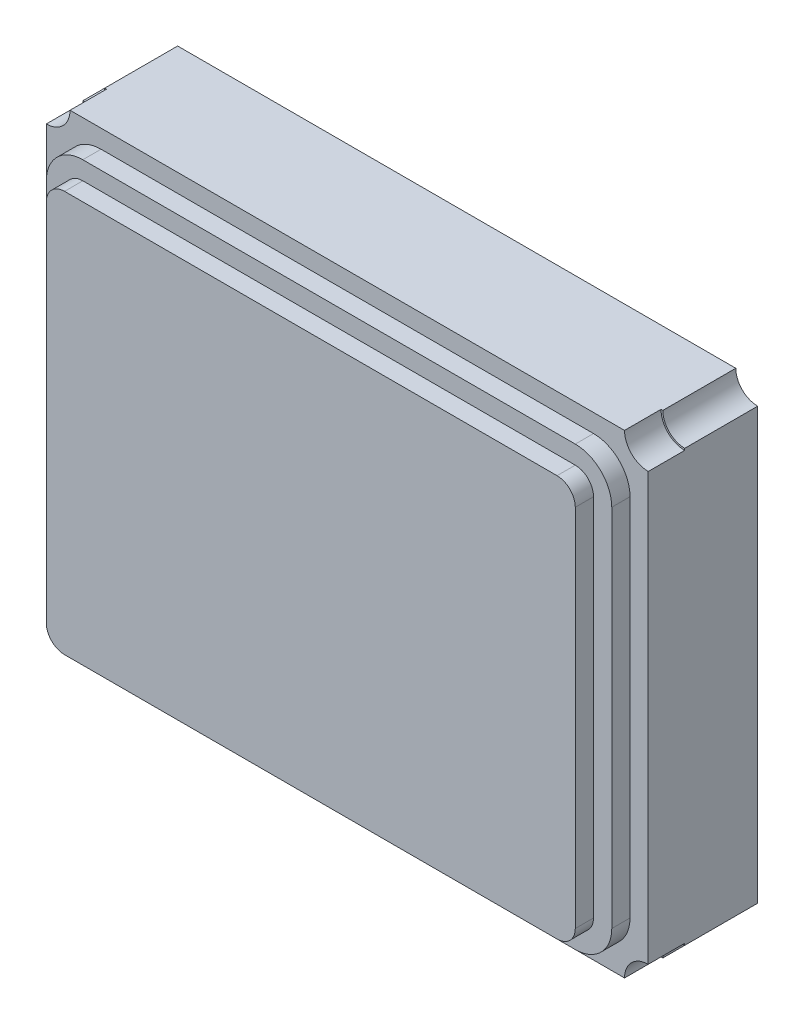
ISO-10303-21;
HEADER;
FILE_DESCRIPTION(('STEP AP214'),'2;1');
FILE_NAME('part.step','',(''),(''),'','','');
FILE_SCHEMA(('AUTOMOTIVE_DESIGN { 1 0 10303 214 1 1 1 1 }'));
ENDSEC;
DATA;
#1=APPLICATION_CONTEXT('core data for automotive mechanical design processes');
#2=APPLICATION_PROTOCOL_DEFINITION('international standard','automotive_design',2000,#1);
#3=PRODUCT_CONTEXT('',#1,'mechanical');
#4=PRODUCT('Part','Part','',(#3));
#5=PRODUCT_RELATED_PRODUCT_CATEGORY('part','',(#4));
#6=PRODUCT_DEFINITION_FORMATION('','',#4);
#7=PRODUCT_DEFINITION_CONTEXT('part definition',#1,'design');
#8=PRODUCT_DEFINITION('design','',#6,#7);
#9=PRODUCT_DEFINITION_SHAPE('','',#8);
#10=(LENGTH_UNIT() NAMED_UNIT(*) SI_UNIT(.MILLI.,.METRE.));
#11=(NAMED_UNIT(*) PLANE_ANGLE_UNIT() SI_UNIT($,.RADIAN.));
#12=(NAMED_UNIT(*) SI_UNIT($,.STERADIAN.) SOLID_ANGLE_UNIT());
#13=UNCERTAINTY_MEASURE_WITH_UNIT(LENGTH_MEASURE(1.E-05),#10,'distance_accuracy_value','');
#14=(GEOMETRIC_REPRESENTATION_CONTEXT(3) GLOBAL_UNCERTAINTY_ASSIGNED_CONTEXT((#13)) GLOBAL_UNIT_ASSIGNED_CONTEXT((#10,
#11,#12)) REPRESENTATION_CONTEXT('',''));
#15=CARTESIAN_POINT('',(0.,0.,0.));
#16=DIRECTION('',(0.,0.,1.));
#17=DIRECTION('',(1.,0.,0.));
#18=AXIS2_PLACEMENT_3D('',#15,#16,#17);
#19=CARTESIAN_POINT('',(1.65,-1.3,0.8));
#20=DIRECTION('',(0.,0.,-1.));
#21=DIRECTION('',(-1.,0.,0.));
#22=AXIS2_PLACEMENT_3D('',#19,#20,#21);
#23=CYLINDRICAL_SURFACE('',#22,0.12);
#24=DIRECTION('',(0.,0.,-1.));
#25=VECTOR('',#24,1.);
#26=CARTESIAN_POINT('',(1.65,-1.18,0.8));
#27=LINE('',#26,#25);
#28=CARTESIAN_POINT('',(1.65,-1.18,0.4));
#29=VERTEX_POINT('',#28);
#30=CARTESIAN_POINT('',(1.65,-1.18,0.));
#31=VERTEX_POINT('',#30);
#32=EDGE_CURVE('E469',#29,#31,#27,.T.);
#33=ORIENTED_EDGE('',*,*,#32,.F.);
#34=CARTESIAN_POINT('',(1.65,-1.3,0.4));
#35=DIRECTION('',(0.,0.,1.));
#36=DIRECTION('',(1.,0.,0.));
#37=AXIS2_PLACEMENT_3D('',#34,#35,#36);
#38=CIRCLE('',#37,0.12);
#39=CARTESIAN_POINT('',(1.53,-1.3,0.4));
#40=VERTEX_POINT('',#39);
#41=EDGE_CURVE('E247',#29,#40,#38,.T.);
#42=ORIENTED_EDGE('',*,*,#41,.T.);
#43=DIRECTION('',(0.,0.,-1.));
#44=VECTOR('',#43,1.);
#45=CARTESIAN_POINT('',(1.53,-1.3,0.8));
#46=LINE('',#45,#44);
#47=CARTESIAN_POINT('',(1.53,-1.3,0.));
#48=VERTEX_POINT('',#47);
#49=EDGE_CURVE('E471',#40,#48,#46,.T.);
#50=ORIENTED_EDGE('',*,*,#49,.T.);
#51=CARTESIAN_POINT('',(1.65,-1.3,0.));
#52=DIRECTION('',(0.,0.,1.));
#53=DIRECTION('',(1.,0.,0.));
#54=AXIS2_PLACEMENT_3D('',#51,#52,#53);
#55=CIRCLE('',#54,0.12);
#56=EDGE_CURVE('E446',#31,#48,#55,.T.);
#57=ORIENTED_EDGE('',*,*,#56,.F.);
#58=EDGE_LOOP('',(#33,#42,#50,#57));
#59=FACE_BOUND('',#58,.T.);
#60=ADVANCED_FACE('F38',(#59),#23,.F.);
#61=CARTESIAN_POINT('',(-1.65,1.3,0.8));
#62=DIRECTION('',(0.,0.,-1.));
#63=DIRECTION('',(-1.,0.,0.));
#64=AXIS2_PLACEMENT_3D('',#61,#62,#63);
#65=CYLINDRICAL_SURFACE('',#64,0.12);
#66=DIRECTION('',(0.,0.,-1.));
#67=VECTOR('',#66,1.);
#68=CARTESIAN_POINT('',(-1.65,1.18,0.8));
#69=LINE('',#68,#67);
#70=CARTESIAN_POINT('',(-1.65,1.18,0.4));
#71=VERTEX_POINT('',#70);
#72=CARTESIAN_POINT('',(-1.65,1.18,0.));
#73=VERTEX_POINT('',#72);
#74=EDGE_CURVE('E461',#71,#73,#69,.T.);
#75=ORIENTED_EDGE('',*,*,#74,.F.);
#76=CARTESIAN_POINT('',(-1.65,1.3,0.4));
#77=DIRECTION('',(0.,0.,1.));
#78=DIRECTION('',(1.,0.,0.));
#79=AXIS2_PLACEMENT_3D('',#76,#77,#78);
#80=CIRCLE('',#79,0.12);
#81=CARTESIAN_POINT('',(-1.53,1.3,0.4));
#82=VERTEX_POINT('',#81);
#83=EDGE_CURVE('E61',#71,#82,#80,.T.);
#84=ORIENTED_EDGE('',*,*,#83,.T.);
#85=DIRECTION('',(0.,0.,-1.));
#86=VECTOR('',#85,1.);
#87=CARTESIAN_POINT('',(-1.53,1.3,0.8));
#88=LINE('',#87,#86);
#89=CARTESIAN_POINT('',(-1.53,1.3,0.));
#90=VERTEX_POINT('',#89);
#91=EDGE_CURVE('E463',#82,#90,#88,.T.);
#92=ORIENTED_EDGE('',*,*,#91,.T.);
#93=CARTESIAN_POINT('',(-1.65,1.3,0.));
#94=DIRECTION('',(0.,0.,1.));
#95=DIRECTION('',(1.,0.,0.));
#96=AXIS2_PLACEMENT_3D('',#93,#94,#95);
#97=CIRCLE('',#96,0.12);
#98=EDGE_CURVE('E458',#73,#90,#97,.T.);
#99=ORIENTED_EDGE('',*,*,#98,.F.);
#100=EDGE_LOOP('',(#75,#84,#92,#99));
#101=FACE_BOUND('',#100,.T.);
#102=ADVANCED_FACE('F540',(#101),#65,.F.);
#103=CARTESIAN_POINT('',(1.65,1.3,0.8));
#104=DIRECTION('',(0.,0.,-1.));
#105=DIRECTION('',(-1.,0.,0.));
#106=AXIS2_PLACEMENT_3D('',#103,#104,#105);
#107=CYLINDRICAL_SURFACE('',#106,0.12);
#108=DIRECTION('',(0.,0.,-1.));
#109=VECTOR('',#108,1.);
#110=CARTESIAN_POINT('',(1.53,1.3,0.8));
#111=LINE('',#110,#109);
#112=CARTESIAN_POINT('',(1.53,1.3,0.4));
#113=VERTEX_POINT('',#112);
#114=CARTESIAN_POINT('',(1.53,1.3,0.));
#115=VERTEX_POINT('',#114);
#116=EDGE_CURVE('E465',#113,#115,#111,.T.);
#117=ORIENTED_EDGE('',*,*,#116,.F.);
#118=CARTESIAN_POINT('',(1.65,1.3,0.4));
#119=DIRECTION('',(0.,0.,1.));
#120=DIRECTION('',(1.,0.,0.));
#121=AXIS2_PLACEMENT_3D('',#118,#119,#120);
#122=CIRCLE('',#121,0.12);
#123=CARTESIAN_POINT('',(1.65,1.18,0.4));
#124=VERTEX_POINT('',#123);
#125=EDGE_CURVE('E311',#113,#124,#122,.T.);
#126=ORIENTED_EDGE('',*,*,#125,.T.);
#127=DIRECTION('',(0.,0.,-1.));
#128=VECTOR('',#127,1.);
#129=CARTESIAN_POINT('',(1.65,1.18,0.8));
#130=LINE('',#129,#128);
#131=CARTESIAN_POINT('',(1.65,1.18,0.));
#132=VERTEX_POINT('',#131);
#133=EDGE_CURVE('E467',#124,#132,#130,.T.);
#134=ORIENTED_EDGE('',*,*,#133,.T.);
#135=CARTESIAN_POINT('',(1.65,1.3,0.));
#136=DIRECTION('',(0.,0.,1.));
#137=DIRECTION('',(1.,0.,0.));
#138=AXIS2_PLACEMENT_3D('',#135,#136,#137);
#139=CIRCLE('',#138,0.12);
#140=EDGE_CURVE('E452',#115,#132,#139,.T.);
#141=ORIENTED_EDGE('',*,*,#140,.F.);
#142=EDGE_LOOP('',(#117,#126,#134,#141));
#143=FACE_BOUND('',#142,.T.);
#144=ADVANCED_FACE('F546',(#143),#107,.F.);
#145=CARTESIAN_POINT('',(0.,0.,0.7));
#146=DIRECTION('',(0.,0.,1.));
#147=DIRECTION('',(1.,0.,0.));
#148=AXIS2_PLACEMENT_3D('',#145,#146,#147);
#149=PLANE('',#148);
#150=DIRECTION('',(1.,0.,0.));
#151=VECTOR('',#150,1.);
#152=CARTESIAN_POINT('',(-1.35,-1.1,0.7));
#153=LINE('',#152,#151);
#154=CARTESIAN_POINT('',(-1.35,-1.1,0.7));
#155=VERTEX_POINT('',#154);
#156=CARTESIAN_POINT('',(1.35,-1.1,0.7));
#157=VERTEX_POINT('',#156);
#158=EDGE_CURVE('E395',#155,#157,#153,.T.);
#159=ORIENTED_EDGE('',*,*,#158,.F.);
#160=CARTESIAN_POINT('',(-1.35,-1.,0.7));
#161=DIRECTION('',(0.,0.,1.));
#162=DIRECTION('',(-1.,0.,0.));
#163=AXIS2_PLACEMENT_3D('',#160,#161,#162);
#164=CIRCLE('',#163,0.0999999999999998);
#165=CARTESIAN_POINT('',(-1.45,-1.,0.7));
#166=VERTEX_POINT('',#165);
#167=EDGE_CURVE('E392',#166,#155,#164,.T.);
#168=ORIENTED_EDGE('',*,*,#167,.F.);
#169=DIRECTION('',(0.,-1.,0.));
#170=VECTOR('',#169,1.);
#171=CARTESIAN_POINT('',(-1.45,-1.,0.7));
#172=LINE('',#171,#170);
#173=CARTESIAN_POINT('',(-1.45,1.,0.7));
#174=VERTEX_POINT('',#173);
#175=EDGE_CURVE('E389',#174,#166,#172,.T.);
#176=ORIENTED_EDGE('',*,*,#175,.F.);
#177=CARTESIAN_POINT('',(-1.35,1.,0.7));
#178=DIRECTION('',(0.,0.,1.));
#179=DIRECTION('',(-1.,0.,0.));
#180=AXIS2_PLACEMENT_3D('',#177,#178,#179);
#181=CIRCLE('',#180,0.0999999999999998);
#182=CARTESIAN_POINT('',(-1.35,1.1,0.7));
#183=VERTEX_POINT('',#182);
#184=EDGE_CURVE('E386',#183,#174,#181,.T.);
#185=ORIENTED_EDGE('',*,*,#184,.F.);
#186=DIRECTION('',(-1.,0.,0.));
#187=VECTOR('',#186,1.);
#188=CARTESIAN_POINT('',(-1.35,1.1,0.7));
#189=LINE('',#188,#187);
#190=CARTESIAN_POINT('',(1.35,1.1,0.7));
#191=VERTEX_POINT('',#190);
#192=EDGE_CURVE('E383',#191,#183,#189,.T.);
#193=ORIENTED_EDGE('',*,*,#192,.F.);
#194=CARTESIAN_POINT('',(1.35,1.,0.7));
#195=DIRECTION('',(0.,0.,1.));
#196=DIRECTION('',(-1.,0.,0.));
#197=AXIS2_PLACEMENT_3D('',#194,#195,#196);
#198=CIRCLE('',#197,0.0999999999999998);
#199=CARTESIAN_POINT('',(1.45,1.,0.7));
#200=VERTEX_POINT('',#199);
#201=EDGE_CURVE('E380',#200,#191,#198,.T.);
#202=ORIENTED_EDGE('',*,*,#201,.F.);
#203=DIRECTION('',(0.,1.,0.));
#204=VECTOR('',#203,1.);
#205=CARTESIAN_POINT('',(1.45,-1.,0.7));
#206=LINE('',#205,#204);
#207=CARTESIAN_POINT('',(1.45,-1.,0.7));
#208=VERTEX_POINT('',#207);
#209=EDGE_CURVE('E376',#208,#200,#206,.T.);
#210=ORIENTED_EDGE('',*,*,#209,.F.);
#211=CARTESIAN_POINT('',(1.35,-1.,0.7));
#212=DIRECTION('',(0.,0.,1.));
#213=DIRECTION('',(1.,0.,0.));
#214=AXIS2_PLACEMENT_3D('',#211,#212,#213);
#215=CIRCLE('',#214,0.0999999999999998);
#216=EDGE_CURVE('E373',#157,#208,#215,.T.);
#217=ORIENTED_EDGE('',*,*,#216,.F.);
#218=EDGE_LOOP('',(#159,#168,#176,#185,#193,#202,#210,#217));
#219=FACE_BOUND('',#218,.T.);
#220=DIRECTION('',(1.,0.,0.));
#221=VECTOR('',#220,1.);
#222=CARTESIAN_POINT('',(0.,-1.2,0.7));
#223=LINE('',#222,#221);
#224=CARTESIAN_POINT('',(-1.35,-1.2,0.7));
#225=VERTEX_POINT('',#224);
#226=CARTESIAN_POINT('',(1.35,-1.2,0.7));
#227=VERTEX_POINT('',#226);
#228=EDGE_CURVE('E495',#225,#227,#223,.T.);
#229=ORIENTED_EDGE('',*,*,#228,.T.);
#230=CARTESIAN_POINT('',(1.35,-1.,0.7));
#231=DIRECTION('',(0.,0.,1.));
#232=DIRECTION('',(1.,0.,0.));
#233=AXIS2_PLACEMENT_3D('',#230,#231,#232);
#234=CIRCLE('',#233,0.199999999999999);
#235=CARTESIAN_POINT('',(1.55,-1.,0.7));
#236=VERTEX_POINT('',#235);
#237=EDGE_CURVE('E46',#227,#236,#234,.T.);
#238=ORIENTED_EDGE('',*,*,#237,.T.);
#239=DIRECTION('',(0.,1.,0.));
#240=VECTOR('',#239,1.);
#241=CARTESIAN_POINT('',(1.55,0.,0.7));
#242=LINE('',#241,#240);
#243=CARTESIAN_POINT('',(1.55,1.,0.7));
#244=VERTEX_POINT('',#243);
#245=EDGE_CURVE('E477',#236,#244,#242,.T.);
#246=ORIENTED_EDGE('',*,*,#245,.T.);
#247=CARTESIAN_POINT('',(1.35,1.,0.7));
#248=DIRECTION('',(0.,0.,1.));
#249=DIRECTION('',(1.,0.,0.));
#250=AXIS2_PLACEMENT_3D('',#247,#248,#249);
#251=CIRCLE('',#250,0.199999999999999);
#252=CARTESIAN_POINT('',(1.35,1.2,0.7));
#253=VERTEX_POINT('',#252);
#254=EDGE_CURVE('E480',#244,#253,#251,.T.);
#255=ORIENTED_EDGE('',*,*,#254,.T.);
#256=DIRECTION('',(-1.,0.,0.));
#257=VECTOR('',#256,1.);
#258=CARTESIAN_POINT('',(0.,1.2,0.7));
#259=LINE('',#258,#257);
#260=CARTESIAN_POINT('',(-1.35,1.2,0.7));
#261=VERTEX_POINT('',#260);
#262=EDGE_CURVE('E483',#253,#261,#259,.T.);
#263=ORIENTED_EDGE('',*,*,#262,.T.);
#264=CARTESIAN_POINT('',(-1.35,1.,0.7));
#265=DIRECTION('',(0.,0.,1.));
#266=DIRECTION('',(1.,0.,0.));
#267=AXIS2_PLACEMENT_3D('',#264,#265,#266);
#268=CIRCLE('',#267,0.199999999999999);
#269=CARTESIAN_POINT('',(-1.55,1.,0.7));
#270=VERTEX_POINT('',#269);
#271=EDGE_CURVE('E486',#261,#270,#268,.T.);
#272=ORIENTED_EDGE('',*,*,#271,.T.);
#273=DIRECTION('',(0.,-1.,0.));
#274=VECTOR('',#273,1.);
#275=CARTESIAN_POINT('',(-1.55,0.,0.7));
#276=LINE('',#275,#274);
#277=CARTESIAN_POINT('',(-1.55,-1.,0.7));
#278=VERTEX_POINT('',#277);
#279=EDGE_CURVE('E489',#270,#278,#276,.T.);
#280=ORIENTED_EDGE('',*,*,#279,.T.);
#281=CARTESIAN_POINT('',(-1.35,-1.,0.7));
#282=DIRECTION('',(0.,0.,1.));
#283=DIRECTION('',(1.,0.,0.));
#284=AXIS2_PLACEMENT_3D('',#281,#282,#283);
#285=CIRCLE('',#284,0.199999999999999);
#286=EDGE_CURVE('E492',#278,#225,#285,.T.);
#287=ORIENTED_EDGE('',*,*,#286,.T.);
#288=EDGE_LOOP('',(#229,#238,#246,#255,#263,#272,#280,#287));
#289=FACE_BOUND('',#288,.T.);
#290=ADVANCED_FACE('F499',(#219,#289),#149,.T.);
#291=CARTESIAN_POINT('',(1.35,-1.,0.7));
#292=DIRECTION('',(0.,0.,1.));
#293=DIRECTION('',(1.,0.,0.));
#294=AXIS2_PLACEMENT_3D('',#291,#292,#293);
#295=CYLINDRICAL_SURFACE('',#294,0.0999999999999998);
#296=CARTESIAN_POINT('',(1.35,-1.,0.8));
#297=DIRECTION('',(0.,0.,1.));
#298=DIRECTION('',(1.,0.,0.));
#299=AXIS2_PLACEMENT_3D('',#296,#297,#298);
#300=CIRCLE('',#299,0.0999999999999998);
#301=CARTESIAN_POINT('',(1.35,-1.1,0.8));
#302=VERTEX_POINT('',#301);
#303=CARTESIAN_POINT('',(1.45,-1.,0.8));
#304=VERTEX_POINT('',#303);
#305=EDGE_CURVE('E372',#302,#304,#300,.T.);
#306=ORIENTED_EDGE('',*,*,#305,.F.);
#307=DIRECTION('',(0.,0.,1.));
#308=VECTOR('',#307,1.);
#309=CARTESIAN_POINT('',(1.35,-1.1,0.7));
#310=LINE('',#309,#308);
#311=EDGE_CURVE('E421',#157,#302,#310,.T.);
#312=ORIENTED_EDGE('',*,*,#311,.F.);
#313=ORIENTED_EDGE('',*,*,#216,.T.);
#314=DIRECTION('',(0.,0.,1.));
#315=VECTOR('',#314,1.);
#316=CARTESIAN_POINT('',(1.45,-1.,0.7));
#317=LINE('',#316,#315);
#318=EDGE_CURVE('E398',#208,#304,#317,.T.);
#319=ORIENTED_EDGE('',*,*,#318,.T.);
#320=EDGE_LOOP('',(#306,#312,#313,#319));
#321=FACE_BOUND('',#320,.T.);
#322=ADVANCED_FACE('F799',(#321),#295,.T.);
#323=CARTESIAN_POINT('',(-1.35,-1.1,0.7));
#324=DIRECTION('',(0.,-1.,0.));
#325=DIRECTION('',(0.,0.,-1.));
#326=AXIS2_PLACEMENT_3D('',#323,#324,#325);
#327=PLANE('',#326);
#328=DIRECTION('',(1.,0.,0.));
#329=VECTOR('',#328,1.);
#330=CARTESIAN_POINT('',(-1.35,-1.1,0.8));
#331=LINE('',#330,#329);
#332=CARTESIAN_POINT('',(-1.35,-1.1,0.8));
#333=VERTEX_POINT('',#332);
#334=EDGE_CURVE('E377',#333,#302,#331,.T.);
#335=ORIENTED_EDGE('',*,*,#334,.F.);
#336=DIRECTION('',(0.,0.,1.));
#337=VECTOR('',#336,1.);
#338=CARTESIAN_POINT('',(-1.35,-1.1,0.7));
#339=LINE('',#338,#337);
#340=EDGE_CURVE('E424',#155,#333,#339,.T.);
#341=ORIENTED_EDGE('',*,*,#340,.F.);
#342=ORIENTED_EDGE('',*,*,#158,.T.);
#343=ORIENTED_EDGE('',*,*,#311,.T.);
#344=EDGE_LOOP('',(#335,#341,#342,#343));
#345=FACE_BOUND('',#344,.T.);
#346=ADVANCED_FACE('F809',(#345),#327,.T.);
#347=CARTESIAN_POINT('',(-1.35,-1.,0.7));
#348=DIRECTION('',(0.,0.,1.));
#349=DIRECTION('',(1.,0.,0.));
#350=AXIS2_PLACEMENT_3D('',#347,#348,#349);
#351=CYLINDRICAL_SURFACE('',#350,0.0999999999999998);
#352=CARTESIAN_POINT('',(-1.35,-1.,0.8));
#353=DIRECTION('',(0.,0.,1.));
#354=DIRECTION('',(-1.,0.,0.));
#355=AXIS2_PLACEMENT_3D('',#352,#353,#354);
#356=CIRCLE('',#355,0.0999999999999998);
#357=CARTESIAN_POINT('',(-1.45,-1.,0.8));
#358=VERTEX_POINT('',#357);
#359=EDGE_CURVE('E416',#358,#333,#356,.T.);
#360=ORIENTED_EDGE('',*,*,#359,.F.);
#361=DIRECTION('',(0.,0.,1.));
#362=VECTOR('',#361,1.);
#363=CARTESIAN_POINT('',(-1.45,-1.,0.7));
#364=LINE('',#363,#362);
#365=EDGE_CURVE('E426',#166,#358,#364,.T.);
#366=ORIENTED_EDGE('',*,*,#365,.F.);
#367=ORIENTED_EDGE('',*,*,#167,.T.);
#368=ORIENTED_EDGE('',*,*,#340,.T.);
#369=EDGE_LOOP('',(#360,#366,#367,#368));
#370=FACE_BOUND('',#369,.T.);
#371=ADVANCED_FACE('F817',(#370),#351,.T.);
#372=CARTESIAN_POINT('',(-1.45,-1.,0.7));
#373=DIRECTION('',(-1.,0.,0.));
#374=DIRECTION('',(0.,0.,1.));
#375=AXIS2_PLACEMENT_3D('',#372,#373,#374);
#376=PLANE('',#375);
#377=DIRECTION('',(0.,-1.,0.));
#378=VECTOR('',#377,1.);
#379=CARTESIAN_POINT('',(-1.45,-1.,0.8));
#380=LINE('',#379,#378);
#381=CARTESIAN_POINT('',(-1.45,1.,0.8));
#382=VERTEX_POINT('',#381);
#383=EDGE_CURVE('E413',#382,#358,#380,.T.);
#384=ORIENTED_EDGE('',*,*,#383,.F.);
#385=DIRECTION('',(0.,0.,1.));
#386=VECTOR('',#385,1.);
#387=CARTESIAN_POINT('',(-1.45,1.,0.7));
#388=LINE('',#387,#386);
#389=EDGE_CURVE('E428',#174,#382,#388,.T.);
#390=ORIENTED_EDGE('',*,*,#389,.F.);
#391=ORIENTED_EDGE('',*,*,#175,.T.);
#392=ORIENTED_EDGE('',*,*,#365,.T.);
#393=EDGE_LOOP('',(#384,#390,#391,#392));
#394=FACE_BOUND('',#393,.T.);
#395=ADVANCED_FACE('F825',(#394),#376,.T.);
#396=CARTESIAN_POINT('',(-1.35,1.,0.7));
#397=DIRECTION('',(0.,0.,1.));
#398=DIRECTION('',(1.,0.,0.));
#399=AXIS2_PLACEMENT_3D('',#396,#397,#398);
#400=CYLINDRICAL_SURFACE('',#399,0.0999999999999998);
#401=CARTESIAN_POINT('',(-1.35,1.,0.8));
#402=DIRECTION('',(0.,0.,1.));
#403=DIRECTION('',(-1.,0.,0.));
#404=AXIS2_PLACEMENT_3D('',#401,#402,#403);
#405=CIRCLE('',#404,0.0999999999999998);
#406=CARTESIAN_POINT('',(-1.35,1.1,0.8));
#407=VERTEX_POINT('',#406);
#408=EDGE_CURVE('E410',#407,#382,#405,.T.);
#409=ORIENTED_EDGE('',*,*,#408,.F.);
#410=DIRECTION('',(0.,0.,1.));
#411=VECTOR('',#410,1.);
#412=CARTESIAN_POINT('',(-1.35,1.1,0.7));
#413=LINE('',#412,#411);
#414=EDGE_CURVE('E430',#183,#407,#413,.T.);
#415=ORIENTED_EDGE('',*,*,#414,.F.);
#416=ORIENTED_EDGE('',*,*,#184,.T.);
#417=ORIENTED_EDGE('',*,*,#389,.T.);
#418=EDGE_LOOP('',(#409,#415,#416,#417));
#419=FACE_BOUND('',#418,.T.);
#420=ADVANCED_FACE('F833',(#419),#400,.T.);
#421=CARTESIAN_POINT('',(-1.35,1.1,0.7));
#422=DIRECTION('',(0.,1.,0.));
#423=DIRECTION('',(0.,0.,1.));
#424=AXIS2_PLACEMENT_3D('',#421,#422,#423);
#425=PLANE('',#424);
#426=DIRECTION('',(-1.,0.,0.));
#427=VECTOR('',#426,1.);
#428=CARTESIAN_POINT('',(-1.35,1.1,0.8));
#429=LINE('',#428,#427);
#430=CARTESIAN_POINT('',(1.35,1.1,0.8));
#431=VERTEX_POINT('',#430);
#432=EDGE_CURVE('E407',#431,#407,#429,.T.);
#433=ORIENTED_EDGE('',*,*,#432,.F.);
#434=DIRECTION('',(0.,0.,1.));
#435=VECTOR('',#434,1.);
#436=CARTESIAN_POINT('',(1.35,1.1,0.7));
#437=LINE('',#436,#435);
#438=EDGE_CURVE('E432',#191,#431,#437,.T.);
#439=ORIENTED_EDGE('',*,*,#438,.F.);
#440=ORIENTED_EDGE('',*,*,#192,.T.);
#441=ORIENTED_EDGE('',*,*,#414,.T.);
#442=EDGE_LOOP('',(#433,#439,#440,#441));
#443=FACE_BOUND('',#442,.T.);
#444=ADVANCED_FACE('F841',(#443),#425,.T.);
#445=CARTESIAN_POINT('',(1.35,1.,0.7));
#446=DIRECTION('',(0.,0.,1.));
#447=DIRECTION('',(1.,0.,0.));
#448=AXIS2_PLACEMENT_3D('',#445,#446,#447);
#449=CYLINDRICAL_SURFACE('',#448,0.0999999999999998);
#450=CARTESIAN_POINT('',(1.35,1.,0.8));
#451=DIRECTION('',(0.,0.,1.));
#452=DIRECTION('',(-1.,0.,0.));
#453=AXIS2_PLACEMENT_3D('',#450,#451,#452);
#454=CIRCLE('',#453,0.0999999999999998);
#455=CARTESIAN_POINT('',(1.45,1.,0.8));
#456=VERTEX_POINT('',#455);
#457=EDGE_CURVE('E404',#456,#431,#454,.T.);
#458=ORIENTED_EDGE('',*,*,#457,.F.);
#459=DIRECTION('',(0.,0.,1.));
#460=VECTOR('',#459,1.);
#461=CARTESIAN_POINT('',(1.45,1.,0.7));
#462=LINE('',#461,#460);
#463=EDGE_CURVE('E434',#200,#456,#462,.T.);
#464=ORIENTED_EDGE('',*,*,#463,.F.);
#465=ORIENTED_EDGE('',*,*,#201,.T.);
#466=ORIENTED_EDGE('',*,*,#438,.T.);
#467=EDGE_LOOP('',(#458,#464,#465,#466));
#468=FACE_BOUND('',#467,.T.);
#469=ADVANCED_FACE('F849',(#468),#449,.T.);
#470=CARTESIAN_POINT('',(1.45,-1.,0.7));
#471=DIRECTION('',(1.,0.,0.));
#472=DIRECTION('',(0.,0.,-1.));
#473=AXIS2_PLACEMENT_3D('',#470,#471,#472);
#474=PLANE('',#473);
#475=DIRECTION('',(0.,1.,0.));
#476=VECTOR('',#475,1.);
#477=CARTESIAN_POINT('',(1.45,-1.,0.8));
#478=LINE('',#477,#476);
#479=EDGE_CURVE('E401',#304,#456,#478,.T.);
#480=ORIENTED_EDGE('',*,*,#479,.F.);
#481=ORIENTED_EDGE('',*,*,#318,.F.);
#482=ORIENTED_EDGE('',*,*,#209,.T.);
#483=ORIENTED_EDGE('',*,*,#463,.T.);
#484=EDGE_LOOP('',(#480,#481,#482,#483));
#485=FACE_BOUND('',#484,.T.);
#486=ADVANCED_FACE('F788',(#485),#474,.T.);
#487=CARTESIAN_POINT('',(0.,0.,0.8));
#488=DIRECTION('',(0.,0.,1.));
#489=DIRECTION('',(1.,0.,0.));
#490=AXIS2_PLACEMENT_3D('',#487,#488,#489);
#491=PLANE('',#490);
#492=ORIENTED_EDGE('',*,*,#334,.T.);
#493=ORIENTED_EDGE('',*,*,#305,.T.);
#494=ORIENTED_EDGE('',*,*,#479,.T.);
#495=ORIENTED_EDGE('',*,*,#457,.T.);
#496=ORIENTED_EDGE('',*,*,#432,.T.);
#497=ORIENTED_EDGE('',*,*,#408,.T.);
#498=ORIENTED_EDGE('',*,*,#383,.T.);
#499=ORIENTED_EDGE('',*,*,#359,.T.);
#500=EDGE_LOOP('',(#492,#493,#494,#495,#496,#497,#498,#499));
#501=FACE_BOUND('',#500,.T.);
#502=ADVANCED_FACE('F674',(#501),#491,.T.);
#503=CARTESIAN_POINT('',(0.,0.,0.6));
#504=DIRECTION('',(0.,0.,1.));
#505=DIRECTION('',(1.,0.,0.));
#506=AXIS2_PLACEMENT_3D('',#503,#504,#505);
#507=PLANE('',#506);
#508=CARTESIAN_POINT('',(1.65,-1.3,0.6));
#509=DIRECTION('',(0.,0.,1.));
#510=DIRECTION('',(1.,0.,0.));
#511=AXIS2_PLACEMENT_3D('',#508,#509,#510);
#512=CIRCLE('',#511,0.13);
#513=CARTESIAN_POINT('',(1.65,-1.17,0.6));
#514=VERTEX_POINT('',#513);
#515=CARTESIAN_POINT('',(1.52,-1.3,0.6));
#516=VERTEX_POINT('',#515);
#517=EDGE_CURVE('E585',#514,#516,#512,.T.);
#518=ORIENTED_EDGE('',*,*,#517,.F.);
#519=DIRECTION('',(0.,1.,0.));
#520=VECTOR('',#519,1.);
#521=CARTESIAN_POINT('',(1.65,0.,0.6));
#522=LINE('',#521,#520);
#523=CARTESIAN_POINT('',(1.65,1.17,0.6));
#524=VERTEX_POINT('',#523);
#525=EDGE_CURVE('E264',#514,#524,#522,.T.);
#526=ORIENTED_EDGE('',*,*,#525,.T.);
#527=CARTESIAN_POINT('',(1.65,1.3,0.6));
#528=DIRECTION('',(0.,0.,1.));
#529=DIRECTION('',(1.,0.,0.));
#530=AXIS2_PLACEMENT_3D('',#527,#528,#529);
#531=CIRCLE('',#530,0.13);
#532=CARTESIAN_POINT('',(1.52,1.3,0.6));
#533=VERTEX_POINT('',#532);
#534=EDGE_CURVE('E299',#533,#524,#531,.T.);
#535=ORIENTED_EDGE('',*,*,#534,.F.);
#536=DIRECTION('',(1.,0.,0.));
#537=VECTOR('',#536,1.);
#538=CARTESIAN_POINT('',(0.,1.3,0.6));
#539=LINE('',#538,#537);
#540=CARTESIAN_POINT('',(-1.52,1.3,0.6));
#541=VERTEX_POINT('',#540);
#542=EDGE_CURVE('E344',#541,#533,#539,.T.);
#543=ORIENTED_EDGE('',*,*,#542,.F.);
#544=CARTESIAN_POINT('',(-1.65,1.3,0.6));
#545=DIRECTION('',(0.,0.,1.));
#546=DIRECTION('',(1.,0.,0.));
#547=AXIS2_PLACEMENT_3D('',#544,#545,#546);
#548=CIRCLE('',#547,0.13);
#549=CARTESIAN_POINT('',(-1.65,1.17,0.6));
#550=VERTEX_POINT('',#549);
#551=EDGE_CURVE('E270',#550,#541,#548,.T.);
#552=ORIENTED_EDGE('',*,*,#551,.F.);
#553=DIRECTION('',(0.,1.,0.));
#554=VECTOR('',#553,1.);
#555=CARTESIAN_POINT('',(-1.65,0.,0.6));
#556=LINE('',#555,#554);
#557=CARTESIAN_POINT('',(-1.65,-1.17,0.6));
#558=VERTEX_POINT('',#557);
#559=EDGE_CURVE('E369',#558,#550,#556,.T.);
#560=ORIENTED_EDGE('',*,*,#559,.F.);
#561=CARTESIAN_POINT('',(-1.65,-1.3,0.6));
#562=DIRECTION('',(0.,0.,1.));
#563=DIRECTION('',(-1.,0.,0.));
#564=AXIS2_PLACEMENT_3D('',#561,#562,#563);
#565=CIRCLE('',#564,0.13);
#566=CARTESIAN_POINT('',(-1.52,-1.3,0.6));
#567=VERTEX_POINT('',#566);
#568=EDGE_CURVE('E283',#567,#558,#565,.T.);
#569=ORIENTED_EDGE('',*,*,#568,.F.);
#570=DIRECTION('',(1.,0.,0.));
#571=VECTOR('',#570,1.);
#572=CARTESIAN_POINT('',(0.,-1.3,0.6));
#573=LINE('',#572,#571);
#574=EDGE_CURVE('E366',#567,#516,#573,.T.);
#575=ORIENTED_EDGE('',*,*,#574,.T.);
#576=EDGE_LOOP('',(#518,#526,#535,#543,#552,#560,#569,#575));
#577=FACE_BOUND('',#576,.T.);
#578=DIRECTION('',(1.,0.,0.));
#579=VECTOR('',#578,1.);
#580=CARTESIAN_POINT('',(-1.35,-1.2,0.6));
#581=LINE('',#580,#579);
#582=CARTESIAN_POINT('',(-1.35,-1.2,0.6));
#583=VERTEX_POINT('',#582);
#584=CARTESIAN_POINT('',(1.35,-1.2,0.6));
#585=VERTEX_POINT('',#584);
#586=EDGE_CURVE('E337',#583,#585,#581,.T.);
#587=ORIENTED_EDGE('',*,*,#586,.F.);
#588=CARTESIAN_POINT('',(-1.35,-1.,0.6));
#589=DIRECTION('',(0.,0.,1.));
#590=DIRECTION('',(-1.,0.,0.));
#591=AXIS2_PLACEMENT_3D('',#588,#589,#590);
#592=CIRCLE('',#591,0.199999999999999);
#593=CARTESIAN_POINT('',(-1.55,-1.,0.6));
#594=VERTEX_POINT('',#593);
#595=EDGE_CURVE('E334',#594,#583,#592,.T.);
#596=ORIENTED_EDGE('',*,*,#595,.F.);
#597=DIRECTION('',(0.,-1.,0.));
#598=VECTOR('',#597,1.);
#599=CARTESIAN_POINT('',(-1.55,-1.,0.6));
#600=LINE('',#599,#598);
#601=CARTESIAN_POINT('',(-1.55,1.,0.6));
#602=VERTEX_POINT('',#601);
#603=EDGE_CURVE('E331',#602,#594,#600,.T.);
#604=ORIENTED_EDGE('',*,*,#603,.F.);
#605=CARTESIAN_POINT('',(-1.35,1.,0.6));
#606=DIRECTION('',(0.,0.,1.));
#607=DIRECTION('',(-1.,0.,0.));
#608=AXIS2_PLACEMENT_3D('',#605,#606,#607);
#609=CIRCLE('',#608,0.199999999999999);
#610=CARTESIAN_POINT('',(-1.35,1.2,0.6));
#611=VERTEX_POINT('',#610);
#612=EDGE_CURVE('E328',#611,#602,#609,.T.);
#613=ORIENTED_EDGE('',*,*,#612,.F.);
#614=DIRECTION('',(-1.,0.,0.));
#615=VECTOR('',#614,1.);
#616=CARTESIAN_POINT('',(-1.35,1.2,0.6));
#617=LINE('',#616,#615);
#618=CARTESIAN_POINT('',(1.35,1.2,0.6));
#619=VERTEX_POINT('',#618);
#620=EDGE_CURVE('E325',#619,#611,#617,.T.);
#621=ORIENTED_EDGE('',*,*,#620,.F.);
#622=CARTESIAN_POINT('',(1.35,1.,0.6));
#623=DIRECTION('',(0.,0.,1.));
#624=DIRECTION('',(-1.,0.,0.));
#625=AXIS2_PLACEMENT_3D('',#622,#623,#624);
#626=CIRCLE('',#625,0.199999999999999);
#627=CARTESIAN_POINT('',(1.55,1.,0.6));
#628=VERTEX_POINT('',#627);
#629=EDGE_CURVE('E322',#628,#619,#626,.T.);
#630=ORIENTED_EDGE('',*,*,#629,.F.);
#631=DIRECTION('',(0.,1.,0.));
#632=VECTOR('',#631,1.);
#633=CARTESIAN_POINT('',(1.55,-1.,0.6));
#634=LINE('',#633,#632);
#635=CARTESIAN_POINT('',(1.55,-1.,0.6));
#636=VERTEX_POINT('',#635);
#637=EDGE_CURVE('E319',#636,#628,#634,.T.);
#638=ORIENTED_EDGE('',*,*,#637,.F.);
#639=CARTESIAN_POINT('',(1.35,-1.,0.6));
#640=DIRECTION('',(0.,0.,1.));
#641=DIRECTION('',(1.,0.,0.));
#642=AXIS2_PLACEMENT_3D('',#639,#640,#641);
#643=CIRCLE('',#642,0.199999999999999);
#644=EDGE_CURVE('E316',#585,#636,#643,.T.);
#645=ORIENTED_EDGE('',*,*,#644,.F.);
#646=EDGE_LOOP('',(#587,#596,#604,#613,#621,#630,#638,#645));
#647=FACE_BOUND('',#646,.T.);
#648=ADVANCED_FACE('F508',(#577,#647),#507,.T.);
#649=CARTESIAN_POINT('',(1.35,-1.,0.6));
#650=DIRECTION('',(0.,0.,1.));
#651=DIRECTION('',(1.,0.,0.));
#652=AXIS2_PLACEMENT_3D('',#649,#650,#651);
#653=CYLINDRICAL_SURFACE('',#652,0.199999999999999);
#654=DIRECTION('',(0.,0.,1.));
#655=VECTOR('',#654,1.);
#656=CARTESIAN_POINT('',(1.35,-1.2,0.6));
#657=LINE('',#656,#655);
#658=EDGE_CURVE('E341',#585,#227,#657,.T.);
#659=ORIENTED_EDGE('',*,*,#658,.F.);
#660=ORIENTED_EDGE('',*,*,#644,.T.);
#661=DIRECTION('',(0.,0.,1.));
#662=VECTOR('',#661,1.);
#663=CARTESIAN_POINT('',(1.55,-1.,0.6));
#664=LINE('',#663,#662);
#665=EDGE_CURVE('E340',#636,#236,#664,.T.);
#666=ORIENTED_EDGE('',*,*,#665,.T.);
#667=ORIENTED_EDGE('',*,*,#237,.F.);
#668=EDGE_LOOP('',(#659,#660,#666,#667));
#669=FACE_BOUND('',#668,.T.);
#670=ADVANCED_FACE('F501',(#669),#653,.T.);
#671=CARTESIAN_POINT('',(-1.35,-1.2,0.6));
#672=DIRECTION('',(0.,-1.,0.));
#673=DIRECTION('',(0.,0.,-1.));
#674=AXIS2_PLACEMENT_3D('',#671,#672,#673);
#675=PLANE('',#674);
#676=DIRECTION('',(0.,0.,1.));
#677=VECTOR('',#676,1.);
#678=CARTESIAN_POINT('',(-1.35,-1.2,0.6));
#679=LINE('',#678,#677);
#680=EDGE_CURVE('E345',#583,#225,#679,.T.);
#681=ORIENTED_EDGE('',*,*,#680,.F.);
#682=ORIENTED_EDGE('',*,*,#586,.T.);
#683=ORIENTED_EDGE('',*,*,#658,.T.);
#684=ORIENTED_EDGE('',*,*,#228,.F.);
#685=EDGE_LOOP('',(#681,#682,#683,#684));
#686=FACE_BOUND('',#685,.T.);
#687=ADVANCED_FACE('F504',(#686),#675,.T.);
#688=CARTESIAN_POINT('',(-1.35,-1.,0.6));
#689=DIRECTION('',(0.,0.,1.));
#690=DIRECTION('',(1.,0.,0.));
#691=AXIS2_PLACEMENT_3D('',#688,#689,#690);
#692=CYLINDRICAL_SURFACE('',#691,0.199999999999999);
#693=DIRECTION('',(0.,0.,1.));
#694=VECTOR('',#693,1.);
#695=CARTESIAN_POINT('',(-1.55,-1.,0.6));
#696=LINE('',#695,#694);
#697=EDGE_CURVE('E348',#594,#278,#696,.T.);
#698=ORIENTED_EDGE('',*,*,#697,.F.);
#699=ORIENTED_EDGE('',*,*,#595,.T.);
#700=ORIENTED_EDGE('',*,*,#680,.T.);
#701=ORIENTED_EDGE('',*,*,#286,.F.);
#702=EDGE_LOOP('',(#698,#699,#700,#701));
#703=FACE_BOUND('',#702,.T.);
#704=ADVANCED_FACE('F512',(#703),#692,.T.);
#705=CARTESIAN_POINT('',(-1.55,-1.,0.6));
#706=DIRECTION('',(-1.,0.,0.));
#707=DIRECTION('',(0.,0.,1.));
#708=AXIS2_PLACEMENT_3D('',#705,#706,#707);
#709=PLANE('',#708);
#710=DIRECTION('',(0.,0.,1.));
#711=VECTOR('',#710,1.);
#712=CARTESIAN_POINT('',(-1.55,1.,0.6));
#713=LINE('',#712,#711);
#714=EDGE_CURVE('E351',#602,#270,#713,.T.);
#715=ORIENTED_EDGE('',*,*,#714,.F.);
#716=ORIENTED_EDGE('',*,*,#603,.T.);
#717=ORIENTED_EDGE('',*,*,#697,.T.);
#718=ORIENTED_EDGE('',*,*,#279,.F.);
#719=EDGE_LOOP('',(#715,#716,#717,#718));
#720=FACE_BOUND('',#719,.T.);
#721=ADVANCED_FACE('F514',(#720),#709,.T.);
#722=CARTESIAN_POINT('',(-1.35,1.,0.6));
#723=DIRECTION('',(0.,0.,1.));
#724=DIRECTION('',(1.,0.,0.));
#725=AXIS2_PLACEMENT_3D('',#722,#723,#724);
#726=CYLINDRICAL_SURFACE('',#725,0.199999999999999);
#727=DIRECTION('',(0.,0.,1.));
#728=VECTOR('',#727,1.);
#729=CARTESIAN_POINT('',(-1.35,1.2,0.6));
#730=LINE('',#729,#728);
#731=EDGE_CURVE('E354',#611,#261,#730,.T.);
#732=ORIENTED_EDGE('',*,*,#731,.F.);
#733=ORIENTED_EDGE('',*,*,#612,.T.);
#734=ORIENTED_EDGE('',*,*,#714,.T.);
#735=ORIENTED_EDGE('',*,*,#271,.F.);
#736=EDGE_LOOP('',(#732,#733,#734,#735));
#737=FACE_BOUND('',#736,.T.);
#738=ADVANCED_FACE('F516',(#737),#726,.T.);
#739=CARTESIAN_POINT('',(-1.35,1.2,0.6));
#740=DIRECTION('',(0.,1.,0.));
#741=DIRECTION('',(0.,0.,1.));
#742=AXIS2_PLACEMENT_3D('',#739,#740,#741);
#743=PLANE('',#742);
#744=DIRECTION('',(0.,0.,1.));
#745=VECTOR('',#744,1.);
#746=CARTESIAN_POINT('',(1.35,1.2,0.6));
#747=LINE('',#746,#745);
#748=EDGE_CURVE('E357',#619,#253,#747,.T.);
#749=ORIENTED_EDGE('',*,*,#748,.F.);
#750=ORIENTED_EDGE('',*,*,#620,.T.);
#751=ORIENTED_EDGE('',*,*,#731,.T.);
#752=ORIENTED_EDGE('',*,*,#262,.F.);
#753=EDGE_LOOP('',(#749,#750,#751,#752));
#754=FACE_BOUND('',#753,.T.);
#755=ADVANCED_FACE('F519',(#754),#743,.T.);
#756=CARTESIAN_POINT('',(1.35,1.,0.6));
#757=DIRECTION('',(0.,0.,1.));
#758=DIRECTION('',(1.,0.,0.));
#759=AXIS2_PLACEMENT_3D('',#756,#757,#758);
#760=CYLINDRICAL_SURFACE('',#759,0.199999999999999);
#761=DIRECTION('',(0.,0.,1.));
#762=VECTOR('',#761,1.);
#763=CARTESIAN_POINT('',(1.55,1.,0.6));
#764=LINE('',#763,#762);
#765=EDGE_CURVE('E360',#628,#244,#764,.T.);
#766=ORIENTED_EDGE('',*,*,#765,.F.);
#767=ORIENTED_EDGE('',*,*,#629,.T.);
#768=ORIENTED_EDGE('',*,*,#748,.T.);
#769=ORIENTED_EDGE('',*,*,#254,.F.);
#770=EDGE_LOOP('',(#766,#767,#768,#769));
#771=FACE_BOUND('',#770,.T.);
#772=ADVANCED_FACE('F523',(#771),#760,.T.);
#773=CARTESIAN_POINT('',(1.55,-1.,0.6));
#774=DIRECTION('',(1.,0.,0.));
#775=DIRECTION('',(0.,0.,-1.));
#776=AXIS2_PLACEMENT_3D('',#773,#774,#775);
#777=PLANE('',#776);
#778=ORIENTED_EDGE('',*,*,#665,.F.);
#779=ORIENTED_EDGE('',*,*,#637,.T.);
#780=ORIENTED_EDGE('',*,*,#765,.T.);
#781=ORIENTED_EDGE('',*,*,#245,.F.);
#782=EDGE_LOOP('',(#778,#779,#780,#781));
#783=FACE_BOUND('',#782,.T.);
#784=ADVANCED_FACE('F526',(#783),#777,.T.);
#785=CARTESIAN_POINT('',(0.,0.,0.));
#786=DIRECTION('',(0.,0.,1.));
#787=DIRECTION('',(1.,0.,0.));
#788=AXIS2_PLACEMENT_3D('',#785,#786,#787);
#789=PLANE('',#788);
#790=DIRECTION('',(0.,1.,0.));
#791=VECTOR('',#790,1.);
#792=CARTESIAN_POINT('',(-1.65,0.,0.));
#793=LINE('',#792,#791);
#794=CARTESIAN_POINT('',(-1.65,-1.18,0.));
#795=VERTEX_POINT('',#794);
#796=EDGE_CURVE('E423',#795,#73,#793,.T.);
#797=ORIENTED_EDGE('',*,*,#796,.T.);
#798=ORIENTED_EDGE('',*,*,#98,.T.);
#799=DIRECTION('',(1.,0.,0.));
#800=VECTOR('',#799,1.);
#801=CARTESIAN_POINT('',(0.,1.3,0.));
#802=LINE('',#801,#800);
#803=EDGE_CURVE('E455',#90,#115,#802,.T.);
#804=ORIENTED_EDGE('',*,*,#803,.T.);
#805=ORIENTED_EDGE('',*,*,#140,.T.);
#806=DIRECTION('',(0.,1.,0.));
#807=VECTOR('',#806,1.);
#808=CARTESIAN_POINT('',(1.65,0.,0.));
#809=LINE('',#808,#807);
#810=EDGE_CURVE('E449',#31,#132,#809,.T.);
#811=ORIENTED_EDGE('',*,*,#810,.F.);
#812=ORIENTED_EDGE('',*,*,#56,.T.);
#813=DIRECTION('',(1.,0.,0.));
#814=VECTOR('',#813,1.);
#815=CARTESIAN_POINT('',(0.,-1.3,0.));
#816=LINE('',#815,#814);
#817=CARTESIAN_POINT('',(-1.53,-1.3,0.));
#818=VERTEX_POINT('',#817);
#819=EDGE_CURVE('E443',#818,#48,#816,.T.);
#820=ORIENTED_EDGE('',*,*,#819,.F.);
#821=CARTESIAN_POINT('',(-1.65,-1.3,0.));
#822=DIRECTION('',(0.,0.,1.));
#823=DIRECTION('',(1.,0.,0.));
#824=AXIS2_PLACEMENT_3D('',#821,#822,#823);
#825=CIRCLE('',#824,0.12);
#826=EDGE_CURVE('E440',#795,#818,#825,.F.);
#827=ORIENTED_EDGE('',*,*,#826,.F.);
#828=EDGE_LOOP('',(#797,#798,#804,#805,#811,#812,#820,#827));
#829=FACE_BOUND('',#828,.T.);
#830=ADVANCED_FACE('F528',(#829),#789,.F.);
#831=CARTESIAN_POINT('',(0.,1.3,0.8));
#832=DIRECTION('',(0.,1.,0.));
#833=DIRECTION('',(-1.,0.,0.));
#834=AXIS2_PLACEMENT_3D('',#831,#832,#833);
#835=PLANE('',#834);
#836=DIRECTION('',(0.,0.,1.));
#837=VECTOR('',#836,1.);
#838=CARTESIAN_POINT('',(-1.52,1.3,0.4));
#839=LINE('',#838,#837);
#840=CARTESIAN_POINT('',(-1.52,1.3,0.4));
#841=VERTEX_POINT('',#840);
#842=EDGE_CURVE('E278',#841,#541,#839,.T.);
#843=ORIENTED_EDGE('',*,*,#842,.T.);
#844=ORIENTED_EDGE('',*,*,#542,.T.);
#845=DIRECTION('',(0.,0.,1.));
#846=VECTOR('',#845,1.);
#847=CARTESIAN_POINT('',(1.52,1.3,0.4));
#848=LINE('',#847,#846);
#849=CARTESIAN_POINT('',(1.52,1.3,0.4));
#850=VERTEX_POINT('',#849);
#851=EDGE_CURVE('E306',#850,#533,#848,.T.);
#852=ORIENTED_EDGE('',*,*,#851,.F.);
#853=DIRECTION('',(-1.,0.,0.));
#854=VECTOR('',#853,1.);
#855=CARTESIAN_POINT('',(1.52,1.3,0.4));
#856=LINE('',#855,#854);
#857=EDGE_CURVE('E302',#113,#850,#856,.T.);
#858=ORIENTED_EDGE('',*,*,#857,.F.);
#859=ORIENTED_EDGE('',*,*,#116,.T.);
#860=ORIENTED_EDGE('',*,*,#803,.F.);
#861=ORIENTED_EDGE('',*,*,#91,.F.);
#862=DIRECTION('',(-1.,0.,0.));
#863=VECTOR('',#862,1.);
#864=CARTESIAN_POINT('',(-1.52,1.3,0.4));
#865=LINE('',#864,#863);
#866=EDGE_CURVE('E274',#841,#82,#865,.T.);
#867=ORIENTED_EDGE('',*,*,#866,.F.);
#868=EDGE_LOOP('',(#843,#844,#852,#858,#859,#860,#861,#867));
#869=FACE_BOUND('',#868,.T.);
#870=ADVANCED_FACE('F534',(#869),#835,.T.);
#871=CARTESIAN_POINT('',(1.65,0.,0.8));
#872=DIRECTION('',(-1.,0.,0.));
#873=DIRECTION('',(0.,0.,1.));
#874=AXIS2_PLACEMENT_3D('',#871,#872,#873);
#875=PLANE('',#874);
#876=ORIENTED_EDGE('',*,*,#525,.F.);
#877=DIRECTION('',(0.,0.,1.));
#878=VECTOR('',#877,1.);
#879=CARTESIAN_POINT('',(1.65,-1.17,0.4));
#880=LINE('',#879,#878);
#881=CARTESIAN_POINT('',(1.65,-1.17,0.4));
#882=VERTEX_POINT('',#881);
#883=EDGE_CURVE('E255',#882,#514,#880,.T.);
#884=ORIENTED_EDGE('',*,*,#883,.F.);
#885=DIRECTION('',(0.,1.,0.));
#886=VECTOR('',#885,1.);
#887=CARTESIAN_POINT('',(1.65,-1.17,0.4));
#888=LINE('',#887,#886);
#889=EDGE_CURVE('E244',#29,#882,#888,.T.);
#890=ORIENTED_EDGE('',*,*,#889,.F.);
#891=ORIENTED_EDGE('',*,*,#32,.T.);
#892=ORIENTED_EDGE('',*,*,#810,.T.);
#893=ORIENTED_EDGE('',*,*,#133,.F.);
#894=DIRECTION('',(0.,1.,0.));
#895=VECTOR('',#894,1.);
#896=CARTESIAN_POINT('',(1.65,1.3,0.4));
#897=LINE('',#896,#895);
#898=CARTESIAN_POINT('',(1.65,1.17,0.4));
#899=VERTEX_POINT('',#898);
#900=EDGE_CURVE('E300',#899,#124,#897,.T.);
#901=ORIENTED_EDGE('',*,*,#900,.F.);
#902=DIRECTION('',(0.,0.,1.));
#903=VECTOR('',#902,1.);
#904=CARTESIAN_POINT('',(1.65,1.17,0.4));
#905=LINE('',#904,#903);
#906=EDGE_CURVE('E309',#899,#524,#905,.T.);
#907=ORIENTED_EDGE('',*,*,#906,.T.);
#908=EDGE_LOOP('',(#876,#884,#890,#891,#892,#893,#901,#907));
#909=FACE_BOUND('',#908,.T.);
#910=ADVANCED_FACE('F262',(#909),#875,.F.);
#911=CARTESIAN_POINT('',(0.,-1.3,0.8));
#912=DIRECTION('',(0.,1.,0.));
#913=DIRECTION('',(0.,0.,1.));
#914=AXIS2_PLACEMENT_3D('',#911,#912,#913);
#915=PLANE('',#914);
#916=DIRECTION('',(1.,0.,0.));
#917=VECTOR('',#916,1.);
#918=CARTESIAN_POINT('',(1.65,-1.3,0.4));
#919=LINE('',#918,#917);
#920=CARTESIAN_POINT('',(1.52,-1.3,0.4));
#921=VERTEX_POINT('',#920);
#922=EDGE_CURVE('E251',#921,#40,#919,.T.);
#923=ORIENTED_EDGE('',*,*,#922,.F.);
#924=DIRECTION('',(0.,0.,1.));
#925=VECTOR('',#924,1.);
#926=CARTESIAN_POINT('',(1.52,-1.3,0.4));
#927=LINE('',#926,#925);
#928=EDGE_CURVE('E258',#921,#516,#927,.T.);
#929=ORIENTED_EDGE('',*,*,#928,.T.);
#930=ORIENTED_EDGE('',*,*,#574,.F.);
#931=DIRECTION('',(0.,0.,1.));
#932=VECTOR('',#931,1.);
#933=CARTESIAN_POINT('',(-1.52,-1.3,0.4));
#934=LINE('',#933,#932);
#935=CARTESIAN_POINT('',(-1.52,-1.3,0.4));
#936=VERTEX_POINT('',#935);
#937=EDGE_CURVE('E290',#936,#567,#934,.T.);
#938=ORIENTED_EDGE('',*,*,#937,.F.);
#939=DIRECTION('',(1.,0.,0.));
#940=VECTOR('',#939,1.);
#941=CARTESIAN_POINT('',(-1.65,-1.3,0.4));
#942=LINE('',#941,#940);
#943=CARTESIAN_POINT('',(-1.53,-1.3,0.4));
#944=VERTEX_POINT('',#943);
#945=EDGE_CURVE('E284',#944,#936,#942,.T.);
#946=ORIENTED_EDGE('',*,*,#945,.F.);
#947=DIRECTION('',(0.,0.,-1.));
#948=VECTOR('',#947,1.);
#949=CARTESIAN_POINT('',(-1.53,-1.3,0.8));
#950=LINE('',#949,#948);
#951=EDGE_CURVE('E473',#944,#818,#950,.T.);
#952=ORIENTED_EDGE('',*,*,#951,.T.);
#953=ORIENTED_EDGE('',*,*,#819,.T.);
#954=ORIENTED_EDGE('',*,*,#49,.F.);
#955=EDGE_LOOP('',(#923,#929,#930,#938,#946,#952,#953,#954));
#956=FACE_BOUND('',#955,.T.);
#957=ADVANCED_FACE('F552',(#956),#915,.F.);
#958=CARTESIAN_POINT('',(-1.65,-1.3,0.8));
#959=DIRECTION('',(0.,0.,-1.));
#960=DIRECTION('',(-1.,0.,0.));
#961=AXIS2_PLACEMENT_3D('',#958,#959,#960);
#962=CYLINDRICAL_SURFACE('',#961,0.12);
#963=ORIENTED_EDGE('',*,*,#951,.F.);
#964=CARTESIAN_POINT('',(-1.65,-1.3,0.4));
#965=DIRECTION('',(0.,0.,-1.));
#966=DIRECTION('',(-1.,0.,0.));
#967=AXIS2_PLACEMENT_3D('',#964,#965,#966);
#968=CIRCLE('',#967,0.12);
#969=CARTESIAN_POINT('',(-1.65,-1.18,0.4));
#970=VERTEX_POINT('',#969);
#971=EDGE_CURVE('E295',#944,#970,#968,.F.);
#972=ORIENTED_EDGE('',*,*,#971,.T.);
#973=DIRECTION('',(0.,0.,-1.));
#974=VECTOR('',#973,1.);
#975=CARTESIAN_POINT('',(-1.65,-1.18,0.8));
#976=LINE('',#975,#974);
#977=EDGE_CURVE('E475',#970,#795,#976,.T.);
#978=ORIENTED_EDGE('',*,*,#977,.T.);
#979=ORIENTED_EDGE('',*,*,#826,.T.);
#980=EDGE_LOOP('',(#963,#972,#978,#979));
#981=FACE_BOUND('',#980,.T.);
#982=ADVANCED_FACE('F554',(#981),#962,.F.);
#983=CARTESIAN_POINT('',(-1.65,0.,0.8));
#984=DIRECTION('',(-1.,0.,0.));
#985=DIRECTION('',(0.,0.,1.));
#986=AXIS2_PLACEMENT_3D('',#983,#984,#985);
#987=PLANE('',#986);
#988=DIRECTION('',(0.,0.,1.));
#989=VECTOR('',#988,1.);
#990=CARTESIAN_POINT('',(-1.65,1.17,0.4));
#991=LINE('',#990,#989);
#992=CARTESIAN_POINT('',(-1.65,1.17,0.4));
#993=VERTEX_POINT('',#992);
#994=EDGE_CURVE('E276',#993,#550,#991,.T.);
#995=ORIENTED_EDGE('',*,*,#994,.F.);
#996=DIRECTION('',(0.,1.,0.));
#997=VECTOR('',#996,1.);
#998=CARTESIAN_POINT('',(-1.65,0.,0.4));
#999=LINE('',#998,#997);
#1000=EDGE_CURVE('E12',#993,#71,#999,.T.);
#1001=ORIENTED_EDGE('',*,*,#1000,.T.);
#1002=ORIENTED_EDGE('',*,*,#74,.T.);
#1003=ORIENTED_EDGE('',*,*,#796,.F.);
#1004=ORIENTED_EDGE('',*,*,#977,.F.);
#1005=DIRECTION('',(0.,-1.,0.));
#1006=VECTOR('',#1005,1.);
#1007=CARTESIAN_POINT('',(-1.65,-1.17,0.4));
#1008=LINE('',#1007,#1006);
#1009=CARTESIAN_POINT('',(-1.65,-1.17,0.4));
#1010=VERTEX_POINT('',#1009);
#1011=EDGE_CURVE('E288',#1010,#970,#1008,.T.);
#1012=ORIENTED_EDGE('',*,*,#1011,.F.);
#1013=DIRECTION('',(0.,0.,1.));
#1014=VECTOR('',#1013,1.);
#1015=CARTESIAN_POINT('',(-1.65,-1.17,0.4));
#1016=LINE('',#1015,#1014);
#1017=EDGE_CURVE('E292',#1010,#558,#1016,.T.);
#1018=ORIENTED_EDGE('',*,*,#1017,.T.);
#1019=ORIENTED_EDGE('',*,*,#559,.T.);
#1020=EDGE_LOOP('',(#995,#1001,#1002,#1003,#1004,#1012,#1018,#1019));
#1021=FACE_BOUND('',#1020,.T.);
#1022=ADVANCED_FACE('F40',(#1021),#987,.T.);
#1023=CARTESIAN_POINT('',(1.65,1.3,0.4));
#1024=DIRECTION('',(0.,0.,1.));
#1025=DIRECTION('',(1.,0.,0.));
#1026=AXIS2_PLACEMENT_3D('',#1023,#1024,#1025);
#1027=CYLINDRICAL_SURFACE('',#1026,0.13);
#1028=ORIENTED_EDGE('',*,*,#534,.T.);
#1029=ORIENTED_EDGE('',*,*,#906,.F.);
#1030=CARTESIAN_POINT('',(1.65,1.3,0.4));
#1031=DIRECTION('',(0.,0.,1.));
#1032=DIRECTION('',(1.,0.,0.));
#1033=AXIS2_PLACEMENT_3D('',#1030,#1031,#1032);
#1034=CIRCLE('',#1033,0.13);
#1035=EDGE_CURVE('E304',#850,#899,#1034,.T.);
#1036=ORIENTED_EDGE('',*,*,#1035,.F.);
#1037=ORIENTED_EDGE('',*,*,#851,.T.);
#1038=EDGE_LOOP('',(#1028,#1029,#1036,#1037));
#1039=FACE_BOUND('',#1038,.T.);
#1040=ADVANCED_FACE('F561',(#1039),#1027,.F.);
#1041=CARTESIAN_POINT('',(1.65,1.3,0.4));
#1042=DIRECTION('',(0.,0.,1.));
#1043=DIRECTION('',(1.,0.,0.));
#1044=AXIS2_PLACEMENT_3D('',#1041,#1042,#1043);
#1045=PLANE('',#1044);
#1046=ORIENTED_EDGE('',*,*,#857,.T.);
#1047=ORIENTED_EDGE('',*,*,#1035,.T.);
#1048=ORIENTED_EDGE('',*,*,#900,.T.);
#1049=ORIENTED_EDGE('',*,*,#125,.F.);
#1050=EDGE_LOOP('',(#1046,#1047,#1048,#1049));
#1051=FACE_BOUND('',#1050,.T.);
#1052=ADVANCED_FACE('F607',(#1051),#1045,.T.);
#1053=CARTESIAN_POINT('',(-1.65,-1.3,0.4));
#1054=DIRECTION('',(0.,0.,-1.));
#1055=DIRECTION('',(-1.,0.,0.));
#1056=AXIS2_PLACEMENT_3D('',#1053,#1054,#1055);
#1057=PLANE('',#1056);
#1058=ORIENTED_EDGE('',*,*,#945,.T.);
#1059=CARTESIAN_POINT('',(-1.65,-1.3,0.4));
#1060=DIRECTION('',(0.,0.,1.));
#1061=DIRECTION('',(-1.,0.,0.));
#1062=AXIS2_PLACEMENT_3D('',#1059,#1060,#1061);
#1063=CIRCLE('',#1062,0.13);
#1064=EDGE_CURVE('E286',#936,#1010,#1063,.T.);
#1065=ORIENTED_EDGE('',*,*,#1064,.T.);
#1066=ORIENTED_EDGE('',*,*,#1011,.T.);
#1067=ORIENTED_EDGE('',*,*,#971,.F.);
#1068=EDGE_LOOP('',(#1058,#1065,#1066,#1067));
#1069=FACE_BOUND('',#1068,.T.);
#1070=ADVANCED_FACE('F573',(#1069),#1057,.F.);
#1071=CARTESIAN_POINT('',(-1.65,-1.3,0.4));
#1072=DIRECTION('',(0.,0.,1.));
#1073=DIRECTION('',(1.,0.,0.));
#1074=AXIS2_PLACEMENT_3D('',#1071,#1072,#1073);
#1075=CYLINDRICAL_SURFACE('',#1074,0.13);
#1076=ORIENTED_EDGE('',*,*,#568,.T.);
#1077=ORIENTED_EDGE('',*,*,#1017,.F.);
#1078=ORIENTED_EDGE('',*,*,#1064,.F.);
#1079=ORIENTED_EDGE('',*,*,#937,.T.);
#1080=EDGE_LOOP('',(#1076,#1077,#1078,#1079));
#1081=FACE_BOUND('',#1080,.T.);
#1082=ADVANCED_FACE('F576',(#1081),#1075,.F.);
#1083=CARTESIAN_POINT('',(-1.65,1.3,0.4));
#1084=DIRECTION('',(0.,0.,1.));
#1085=DIRECTION('',(1.,0.,0.));
#1086=AXIS2_PLACEMENT_3D('',#1083,#1084,#1085);
#1087=CYLINDRICAL_SURFACE('',#1086,0.13);
#1088=ORIENTED_EDGE('',*,*,#551,.T.);
#1089=ORIENTED_EDGE('',*,*,#842,.F.);
#1090=CARTESIAN_POINT('',(-1.65,1.3,0.4));
#1091=DIRECTION('',(0.,0.,1.));
#1092=DIRECTION('',(1.,0.,0.));
#1093=AXIS2_PLACEMENT_3D('',#1090,#1091,#1092);
#1094=CIRCLE('',#1093,0.13);
#1095=EDGE_CURVE('E271',#993,#841,#1094,.T.);
#1096=ORIENTED_EDGE('',*,*,#1095,.F.);
#1097=ORIENTED_EDGE('',*,*,#994,.T.);
#1098=EDGE_LOOP('',(#1088,#1089,#1096,#1097));
#1099=FACE_BOUND('',#1098,.T.);
#1100=ADVANCED_FACE('F594',(#1099),#1087,.F.);
#1101=CARTESIAN_POINT('',(-1.65,1.3,0.4));
#1102=DIRECTION('',(0.,0.,1.));
#1103=DIRECTION('',(1.,0.,0.));
#1104=AXIS2_PLACEMENT_3D('',#1101,#1102,#1103);
#1105=PLANE('',#1104);
#1106=ORIENTED_EDGE('',*,*,#1000,.F.);
#1107=ORIENTED_EDGE('',*,*,#1095,.T.);
#1108=ORIENTED_EDGE('',*,*,#866,.T.);
#1109=ORIENTED_EDGE('',*,*,#83,.F.);
#1110=EDGE_LOOP('',(#1106,#1107,#1108,#1109));
#1111=FACE_BOUND('',#1110,.T.);
#1112=ADVANCED_FACE('F596',(#1111),#1105,.T.);
#1113=CARTESIAN_POINT('',(1.65,-1.3,0.4));
#1114=DIRECTION('',(0.,0.,1.));
#1115=DIRECTION('',(1.,0.,0.));
#1116=AXIS2_PLACEMENT_3D('',#1113,#1114,#1115);
#1117=CYLINDRICAL_SURFACE('',#1116,0.13);
#1118=ORIENTED_EDGE('',*,*,#517,.T.);
#1119=ORIENTED_EDGE('',*,*,#928,.F.);
#1120=CARTESIAN_POINT('',(1.65,-1.3,0.4));
#1121=DIRECTION('',(0.,0.,1.));
#1122=DIRECTION('',(1.,0.,0.));
#1123=AXIS2_PLACEMENT_3D('',#1120,#1121,#1122);
#1124=CIRCLE('',#1123,0.13);
#1125=EDGE_CURVE('E53',#882,#921,#1124,.T.);
#1126=ORIENTED_EDGE('',*,*,#1125,.F.);
#1127=ORIENTED_EDGE('',*,*,#883,.T.);
#1128=EDGE_LOOP('',(#1118,#1119,#1126,#1127));
#1129=FACE_BOUND('',#1128,.T.);
#1130=ADVANCED_FACE('F254',(#1129),#1117,.F.);
#1131=CARTESIAN_POINT('',(1.65,-1.3,0.4));
#1132=DIRECTION('',(0.,0.,1.));
#1133=DIRECTION('',(1.,0.,0.));
#1134=AXIS2_PLACEMENT_3D('',#1131,#1132,#1133);
#1135=PLANE('',#1134);
#1136=ORIENTED_EDGE('',*,*,#889,.T.);
#1137=ORIENTED_EDGE('',*,*,#1125,.T.);
#1138=ORIENTED_EDGE('',*,*,#922,.T.);
#1139=ORIENTED_EDGE('',*,*,#41,.F.);
#1140=EDGE_LOOP('',(#1136,#1137,#1138,#1139));
#1141=FACE_BOUND('',#1140,.T.);
#1142=ADVANCED_FACE('F245',(#1141),#1135,.T.);
#1143=CLOSED_SHELL('',(#60,#102,#144,#290,#322,#346,#371,#395,#420,#444,#469,#486,#502,#648,
#670,#687,#704,#721,#738,#755,#772,#784,#830,#870,#910,#957,#982,#1022,#1040,#1052,#1070,#1082,
#1100,#1112,#1130,#1142));
#1144=MANIFOLD_SOLID_BREP('B2',#1143);
#1145=ADVANCED_BREP_SHAPE_REPRESENTATION('',(#18,#1144),#14);
#1146=SHAPE_DEFINITION_REPRESENTATION(#9,#1145);
ENDSEC;
END-ISO-10303-21;
